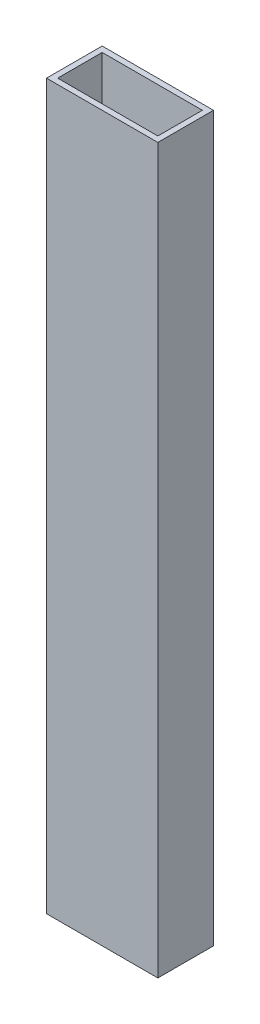
ISO-10303-21;
HEADER;
FILE_DESCRIPTION(('STEP AP214'),'2;1');
FILE_NAME('part.step','',(''),(''),'','','');
FILE_SCHEMA(('AUTOMOTIVE_DESIGN { 1 0 10303 214 1 1 1 1 }'));
ENDSEC;
DATA;
#1=APPLICATION_CONTEXT('core data for automotive mechanical design processes');
#2=APPLICATION_PROTOCOL_DEFINITION('international standard','automotive_design',2000,#1);
#3=PRODUCT_CONTEXT('',#1,'mechanical');
#4=PRODUCT('Part','Part','',(#3));
#5=PRODUCT_RELATED_PRODUCT_CATEGORY('part','',(#4));
#6=PRODUCT_DEFINITION_FORMATION('','',#4);
#7=PRODUCT_DEFINITION_CONTEXT('part definition',#1,'design');
#8=PRODUCT_DEFINITION('design','',#6,#7);
#9=PRODUCT_DEFINITION_SHAPE('','',#8);
#10=(LENGTH_UNIT() NAMED_UNIT(*) SI_UNIT(.MILLI.,.METRE.));
#11=(NAMED_UNIT(*) PLANE_ANGLE_UNIT() SI_UNIT($,.RADIAN.));
#12=(NAMED_UNIT(*) SI_UNIT($,.STERADIAN.) SOLID_ANGLE_UNIT());
#13=UNCERTAINTY_MEASURE_WITH_UNIT(LENGTH_MEASURE(1.E-05),#10,'distance_accuracy_value','');
#14=(GEOMETRIC_REPRESENTATION_CONTEXT(3) GLOBAL_UNCERTAINTY_ASSIGNED_CONTEXT((#13)) GLOBAL_UNIT_ASSIGNED_CONTEXT((#10,
#11,#12)) REPRESENTATION_CONTEXT('',''));
#15=CARTESIAN_POINT('',(0.,0.,0.));
#16=DIRECTION('',(0.,0.,1.));
#17=DIRECTION('',(1.,0.,0.));
#18=AXIS2_PLACEMENT_3D('',#15,#16,#17);
#19=CARTESIAN_POINT('',(0.,330.2,0.));
#20=DIRECTION('',(0.,1.,0.));
#21=DIRECTION('',(0.,0.,1.));
#22=AXIS2_PLACEMENT_3D('',#19,#20,#21);
#23=PLANE('',#22);
#24=DIRECTION('',(0.,0.,1.));
#25=VECTOR('',#24,1.);
#26=CARTESIAN_POINT('',(-50.8,330.2,-25.4));
#27=LINE('',#26,#25);
#28=CARTESIAN_POINT('',(-50.8,330.2,-25.4));
#29=VERTEX_POINT('',#28);
#30=CARTESIAN_POINT('',(-50.8,330.2,0.));
#31=VERTEX_POINT('',#30);
#32=EDGE_CURVE('E177',#29,#31,#27,.T.);
#33=ORIENTED_EDGE('',*,*,#32,.T.);
#34=DIRECTION('',(1.,0.,0.));
#35=VECTOR('',#34,1.);
#36=CARTESIAN_POINT('',(-50.8,330.2,0.));
#37=LINE('',#36,#35);
#38=CARTESIAN_POINT('',(0.,330.2,0.));
#39=VERTEX_POINT('',#38);
#40=EDGE_CURVE('E181',#31,#39,#37,.T.);
#41=ORIENTED_EDGE('',*,*,#40,.T.);
#42=DIRECTION('',(0.,0.,-1.));
#43=VECTOR('',#42,1.);
#44=CARTESIAN_POINT('',(0.,330.2,-25.4));
#45=LINE('',#44,#43);
#46=CARTESIAN_POINT('',(0.,330.2,-25.4));
#47=VERTEX_POINT('',#46);
#48=EDGE_CURVE('E185',#39,#47,#45,.T.);
#49=ORIENTED_EDGE('',*,*,#48,.T.);
#50=DIRECTION('',(-1.,0.,0.));
#51=VECTOR('',#50,1.);
#52=CARTESIAN_POINT('',(-50.8,330.2,-25.4));
#53=LINE('',#52,#51);
#54=EDGE_CURVE('E188',#47,#29,#53,.T.);
#55=ORIENTED_EDGE('',*,*,#54,.T.);
#56=EDGE_LOOP('',(#33,#41,#49,#55));
#57=FACE_BOUND('',#56,.T.);
#58=DIRECTION('',(1.,0.,0.));
#59=VECTOR('',#58,1.);
#60=CARTESIAN_POINT('',(-50.8,330.2,-2.54));
#61=LINE('',#60,#59);
#62=CARTESIAN_POINT('',(-48.26,330.2,-2.54));
#63=VERTEX_POINT('',#62);
#64=CARTESIAN_POINT('',(-2.54,330.2,-2.54));
#65=VERTEX_POINT('',#64);
#66=EDGE_CURVE('E138',#63,#65,#61,.T.);
#67=ORIENTED_EDGE('',*,*,#66,.F.);
#68=DIRECTION('',(0.,0.,1.));
#69=VECTOR('',#68,1.);
#70=CARTESIAN_POINT('',(-48.26,330.2,-25.4));
#71=LINE('',#70,#69);
#72=CARTESIAN_POINT('',(-48.26,330.2,-22.86));
#73=VERTEX_POINT('',#72);
#74=EDGE_CURVE('E129',#73,#63,#71,.T.);
#75=ORIENTED_EDGE('',*,*,#74,.F.);
#76=DIRECTION('',(-1.,0.,0.));
#77=VECTOR('',#76,1.);
#78=CARTESIAN_POINT('',(-50.8,330.2,-22.86));
#79=LINE('',#78,#77);
#80=CARTESIAN_POINT('',(-2.54,330.2,-22.86));
#81=VERTEX_POINT('',#80);
#82=EDGE_CURVE('E155',#81,#73,#79,.T.);
#83=ORIENTED_EDGE('',*,*,#82,.F.);
#84=DIRECTION('',(0.,0.,-1.));
#85=VECTOR('',#84,1.);
#86=CARTESIAN_POINT('',(-2.54,330.2,-25.4));
#87=LINE('',#86,#85);
#88=EDGE_CURVE('E151',#65,#81,#87,.T.);
#89=ORIENTED_EDGE('',*,*,#88,.F.);
#90=EDGE_LOOP('',(#67,#75,#83,#89));
#91=FACE_BOUND('',#90,.T.);
#92=ADVANCED_FACE('F63',(#57,#91),#23,.T.);
#93=CARTESIAN_POINT('',(0.,0.,0.));
#94=DIRECTION('',(0.,1.,0.));
#95=DIRECTION('',(0.,0.,1.));
#96=AXIS2_PLACEMENT_3D('',#93,#94,#95);
#97=PLANE('',#96);
#98=DIRECTION('',(0.,0.,1.));
#99=VECTOR('',#98,1.);
#100=CARTESIAN_POINT('',(-50.8,0.,-25.4));
#101=LINE('',#100,#99);
#102=CARTESIAN_POINT('',(-50.8,0.,-25.4));
#103=VERTEX_POINT('',#102);
#104=CARTESIAN_POINT('',(-50.8,0.,0.));
#105=VERTEX_POINT('',#104);
#106=EDGE_CURVE('E147',#103,#105,#101,.T.);
#107=ORIENTED_EDGE('',*,*,#106,.F.);
#108=DIRECTION('',(-1.,0.,0.));
#109=VECTOR('',#108,1.);
#110=CARTESIAN_POINT('',(-50.8,0.,-25.4));
#111=LINE('',#110,#109);
#112=CARTESIAN_POINT('',(0.,0.,-25.4));
#113=VERTEX_POINT('',#112);
#114=EDGE_CURVE('E182',#113,#103,#111,.T.);
#115=ORIENTED_EDGE('',*,*,#114,.F.);
#116=DIRECTION('',(0.,0.,-1.));
#117=VECTOR('',#116,1.);
#118=CARTESIAN_POINT('',(0.,0.,-25.4));
#119=LINE('',#118,#117);
#120=CARTESIAN_POINT('',(0.,0.,0.));
#121=VERTEX_POINT('',#120);
#122=EDGE_CURVE('E198',#121,#113,#119,.T.);
#123=ORIENTED_EDGE('',*,*,#122,.F.);
#124=DIRECTION('',(1.,0.,0.));
#125=VECTOR('',#124,1.);
#126=CARTESIAN_POINT('',(-50.8,0.,0.));
#127=LINE('',#126,#125);
#128=EDGE_CURVE('E195',#105,#121,#127,.T.);
#129=ORIENTED_EDGE('',*,*,#128,.F.);
#130=EDGE_LOOP('',(#107,#115,#123,#129));
#131=FACE_BOUND('',#130,.T.);
#132=DIRECTION('',(0.,0.,1.));
#133=VECTOR('',#132,1.);
#134=CARTESIAN_POINT('',(-48.26,0.,-25.4));
#135=LINE('',#134,#133);
#136=CARTESIAN_POINT('',(-48.26,0.,-22.86));
#137=VERTEX_POINT('',#136);
#138=CARTESIAN_POINT('',(-48.26,0.,-2.54));
#139=VERTEX_POINT('',#138);
#140=EDGE_CURVE('E87',#137,#139,#135,.T.);
#141=ORIENTED_EDGE('',*,*,#140,.T.);
#142=DIRECTION('',(1.,0.,0.));
#143=VECTOR('',#142,1.);
#144=CARTESIAN_POINT('',(-50.8,0.,-2.54));
#145=LINE('',#144,#143);
#146=CARTESIAN_POINT('',(-2.54,0.,-2.54));
#147=VERTEX_POINT('',#146);
#148=EDGE_CURVE('E145',#139,#147,#145,.T.);
#149=ORIENTED_EDGE('',*,*,#148,.T.);
#150=DIRECTION('',(0.,0.,-1.));
#151=VECTOR('',#150,1.);
#152=CARTESIAN_POINT('',(-2.54,0.,-25.4));
#153=LINE('',#152,#151);
#154=CARTESIAN_POINT('',(-2.54,0.,-22.86));
#155=VERTEX_POINT('',#154);
#156=EDGE_CURVE('E164',#147,#155,#153,.T.);
#157=ORIENTED_EDGE('',*,*,#156,.T.);
#158=DIRECTION('',(-1.,0.,0.));
#159=VECTOR('',#158,1.);
#160=CARTESIAN_POINT('',(-50.8,0.,-22.86));
#161=LINE('',#160,#159);
#162=EDGE_CURVE('E139',#155,#137,#161,.T.);
#163=ORIENTED_EDGE('',*,*,#162,.T.);
#164=EDGE_LOOP('',(#141,#149,#157,#163));
#165=FACE_BOUND('',#164,.T.);
#166=ADVANCED_FACE('F221',(#131,#165),#97,.F.);
#167=CARTESIAN_POINT('',(-50.8,330.2,-25.4));
#168=DIRECTION('',(1.,0.,0.));
#169=DIRECTION('',(0.,0.,-1.));
#170=AXIS2_PLACEMENT_3D('',#167,#168,#169);
#171=PLANE('',#170);
#172=ORIENTED_EDGE('',*,*,#106,.T.);
#173=DIRECTION('',(0.,-1.,0.));
#174=VECTOR('',#173,1.);
#175=CARTESIAN_POINT('',(-50.8,330.2,0.));
#176=LINE('',#175,#174);
#177=EDGE_CURVE('E12',#31,#105,#176,.T.);
#178=ORIENTED_EDGE('',*,*,#177,.F.);
#179=ORIENTED_EDGE('',*,*,#32,.F.);
#180=DIRECTION('',(0.,-1.,0.));
#181=VECTOR('',#180,1.);
#182=CARTESIAN_POINT('',(-50.8,330.2,-25.4));
#183=LINE('',#182,#181);
#184=EDGE_CURVE('E191',#29,#103,#183,.T.);
#185=ORIENTED_EDGE('',*,*,#184,.T.);
#186=EDGE_LOOP('',(#172,#178,#179,#185));
#187=FACE_BOUND('',#186,.T.);
#188=ADVANCED_FACE('F65',(#187),#171,.F.);
#189=CARTESIAN_POINT('',(-50.8,330.2,0.));
#190=DIRECTION('',(0.,0.,-1.));
#191=DIRECTION('',(-1.,0.,0.));
#192=AXIS2_PLACEMENT_3D('',#189,#190,#191);
#193=PLANE('',#192);
#194=ORIENTED_EDGE('',*,*,#128,.T.);
#195=DIRECTION('',(0.,-1.,0.));
#196=VECTOR('',#195,1.);
#197=CARTESIAN_POINT('',(0.,330.2,0.));
#198=LINE('',#197,#196);
#199=EDGE_CURVE('E72',#39,#121,#198,.T.);
#200=ORIENTED_EDGE('',*,*,#199,.F.);
#201=ORIENTED_EDGE('',*,*,#40,.F.);
#202=ORIENTED_EDGE('',*,*,#177,.T.);
#203=EDGE_LOOP('',(#194,#200,#201,#202));
#204=FACE_BOUND('',#203,.T.);
#205=ADVANCED_FACE('F231',(#204),#193,.F.);
#206=CARTESIAN_POINT('',(0.,330.2,-25.4));
#207=DIRECTION('',(-1.,0.,0.));
#208=DIRECTION('',(0.,0.,1.));
#209=AXIS2_PLACEMENT_3D('',#206,#207,#208);
#210=PLANE('',#209);
#211=ORIENTED_EDGE('',*,*,#122,.T.);
#212=DIRECTION('',(0.,-1.,0.));
#213=VECTOR('',#212,1.);
#214=CARTESIAN_POINT('',(0.,330.2,-25.4));
#215=LINE('',#214,#213);
#216=EDGE_CURVE('E206',#47,#113,#215,.T.);
#217=ORIENTED_EDGE('',*,*,#216,.F.);
#218=ORIENTED_EDGE('',*,*,#48,.F.);
#219=ORIENTED_EDGE('',*,*,#199,.T.);
#220=EDGE_LOOP('',(#211,#217,#218,#219));
#221=FACE_BOUND('',#220,.T.);
#222=ADVANCED_FACE('F215',(#221),#210,.F.);
#223=CARTESIAN_POINT('',(-50.8,330.2,-25.4));
#224=DIRECTION('',(0.,0.,1.));
#225=DIRECTION('',(1.,0.,0.));
#226=AXIS2_PLACEMENT_3D('',#223,#224,#225);
#227=PLANE('',#226);
#228=ORIENTED_EDGE('',*,*,#114,.T.);
#229=ORIENTED_EDGE('',*,*,#184,.F.);
#230=ORIENTED_EDGE('',*,*,#54,.F.);
#231=ORIENTED_EDGE('',*,*,#216,.T.);
#232=EDGE_LOOP('',(#228,#229,#230,#231));
#233=FACE_BOUND('',#232,.T.);
#234=ADVANCED_FACE('F225',(#233),#227,.F.);
#235=CARTESIAN_POINT('',(-48.26,330.2,-25.4));
#236=DIRECTION('',(1.,0.,0.));
#237=DIRECTION('',(0.,0.,-1.));
#238=AXIS2_PLACEMENT_3D('',#235,#236,#237);
#239=PLANE('',#238);
#240=ORIENTED_EDGE('',*,*,#140,.F.);
#241=DIRECTION('',(0.,-1.,0.));
#242=VECTOR('',#241,1.);
#243=CARTESIAN_POINT('',(-48.26,330.2,-22.86));
#244=LINE('',#243,#242);
#245=EDGE_CURVE('E133',#73,#137,#244,.T.);
#246=ORIENTED_EDGE('',*,*,#245,.F.);
#247=ORIENTED_EDGE('',*,*,#74,.T.);
#248=DIRECTION('',(0.,-1.,0.));
#249=VECTOR('',#248,1.);
#250=CARTESIAN_POINT('',(-48.26,330.2,-2.54));
#251=LINE('',#250,#249);
#252=EDGE_CURVE('E132',#63,#139,#251,.T.);
#253=ORIENTED_EDGE('',*,*,#252,.T.);
#254=EDGE_LOOP('',(#240,#246,#247,#253));
#255=FACE_BOUND('',#254,.T.);
#256=ADVANCED_FACE('F131',(#255),#239,.T.);
#257=CARTESIAN_POINT('',(-50.8,330.2,-2.54));
#258=DIRECTION('',(0.,0.,-1.));
#259=DIRECTION('',(-1.,0.,0.));
#260=AXIS2_PLACEMENT_3D('',#257,#258,#259);
#261=PLANE('',#260);
#262=ORIENTED_EDGE('',*,*,#148,.F.);
#263=ORIENTED_EDGE('',*,*,#252,.F.);
#264=ORIENTED_EDGE('',*,*,#66,.T.);
#265=DIRECTION('',(0.,-1.,0.));
#266=VECTOR('',#265,1.);
#267=CARTESIAN_POINT('',(-2.54,330.2,-2.54));
#268=LINE('',#267,#266);
#269=EDGE_CURVE('E148',#65,#147,#268,.T.);
#270=ORIENTED_EDGE('',*,*,#269,.T.);
#271=EDGE_LOOP('',(#262,#263,#264,#270));
#272=FACE_BOUND('',#271,.T.);
#273=ADVANCED_FACE('F142',(#272),#261,.T.);
#274=CARTESIAN_POINT('',(-2.54,330.2,-25.4));
#275=DIRECTION('',(-1.,0.,0.));
#276=DIRECTION('',(0.,0.,1.));
#277=AXIS2_PLACEMENT_3D('',#274,#275,#276);
#278=PLANE('',#277);
#279=ORIENTED_EDGE('',*,*,#156,.F.);
#280=ORIENTED_EDGE('',*,*,#269,.F.);
#281=ORIENTED_EDGE('',*,*,#88,.T.);
#282=DIRECTION('',(0.,-1.,0.));
#283=VECTOR('',#282,1.);
#284=CARTESIAN_POINT('',(-2.54,330.2,-22.86));
#285=LINE('',#284,#283);
#286=EDGE_CURVE('E79',#81,#155,#285,.T.);
#287=ORIENTED_EDGE('',*,*,#286,.T.);
#288=EDGE_LOOP('',(#279,#280,#281,#287));
#289=FACE_BOUND('',#288,.T.);
#290=ADVANCED_FACE('F254',(#289),#278,.T.);
#291=CARTESIAN_POINT('',(-50.8,330.2,-22.86));
#292=DIRECTION('',(0.,0.,1.));
#293=DIRECTION('',(1.,0.,0.));
#294=AXIS2_PLACEMENT_3D('',#291,#292,#293);
#295=PLANE('',#294);
#296=ORIENTED_EDGE('',*,*,#162,.F.);
#297=ORIENTED_EDGE('',*,*,#286,.F.);
#298=ORIENTED_EDGE('',*,*,#82,.T.);
#299=ORIENTED_EDGE('',*,*,#245,.T.);
#300=EDGE_LOOP('',(#296,#297,#298,#299));
#301=FACE_BOUND('',#300,.T.);
#302=ADVANCED_FACE('F258',(#301),#295,.T.);
#303=CLOSED_SHELL('',(#92,#166,#188,#205,#222,#234,#256,#273,#290,#302));
#304=MANIFOLD_SOLID_BREP('B2',#303);
#305=ADVANCED_BREP_SHAPE_REPRESENTATION('',(#18,#304),#14);
#306=SHAPE_DEFINITION_REPRESENTATION(#9,#305);
ENDSEC;
END-ISO-10303-21;
